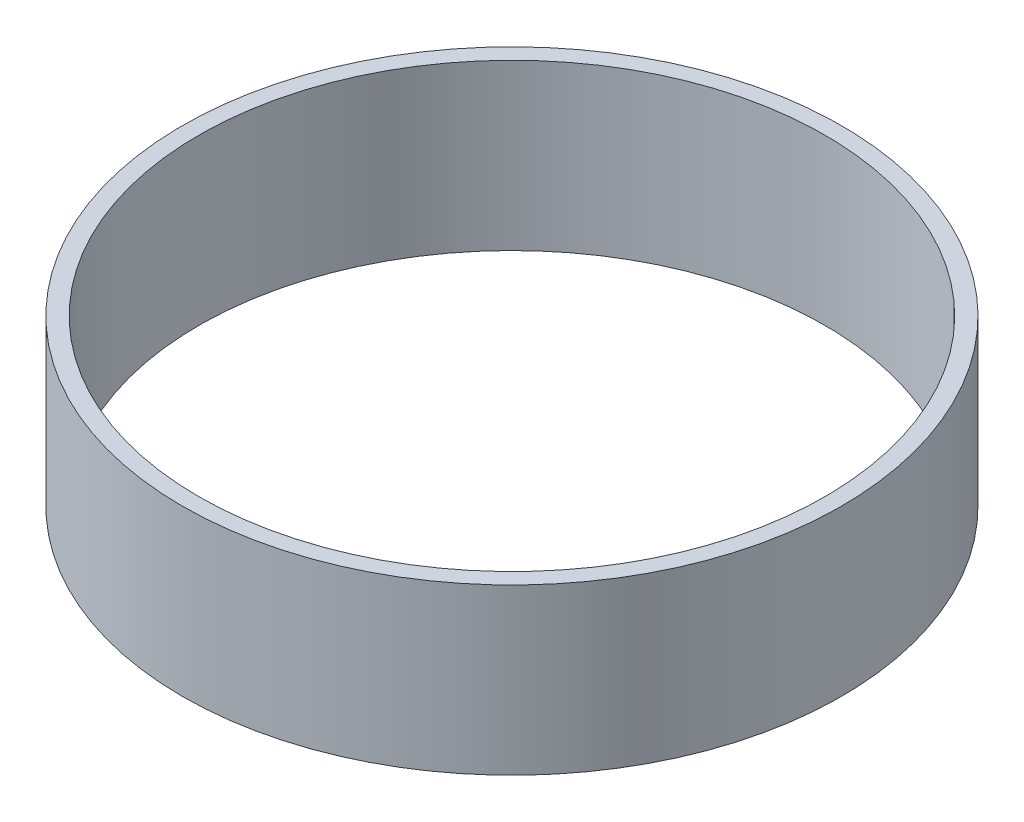
ISO-10303-21;
HEADER;
FILE_DESCRIPTION(('STEP AP214'),'2;1');
FILE_NAME('part.step','',(''),(''),'','','');
FILE_SCHEMA(('AUTOMOTIVE_DESIGN { 1 0 10303 214 1 1 1 1 }'));
ENDSEC;
DATA;
#1=APPLICATION_CONTEXT('core data for automotive mechanical design processes');
#2=APPLICATION_PROTOCOL_DEFINITION('international standard','automotive_design',2000,#1);
#3=PRODUCT_CONTEXT('',#1,'mechanical');
#4=PRODUCT('Part','Part','',(#3));
#5=PRODUCT_RELATED_PRODUCT_CATEGORY('part','',(#4));
#6=PRODUCT_DEFINITION_FORMATION('','',#4);
#7=PRODUCT_DEFINITION_CONTEXT('part definition',#1,'design');
#8=PRODUCT_DEFINITION('design','',#6,#7);
#9=PRODUCT_DEFINITION_SHAPE('','',#8);
#10=(LENGTH_UNIT() NAMED_UNIT(*) SI_UNIT(.MILLI.,.METRE.));
#11=(NAMED_UNIT(*) PLANE_ANGLE_UNIT() SI_UNIT($,.RADIAN.));
#12=(NAMED_UNIT(*) SI_UNIT($,.STERADIAN.) SOLID_ANGLE_UNIT());
#13=UNCERTAINTY_MEASURE_WITH_UNIT(LENGTH_MEASURE(1.E-05),#10,'distance_accuracy_value','');
#14=(GEOMETRIC_REPRESENTATION_CONTEXT(3) GLOBAL_UNCERTAINTY_ASSIGNED_CONTEXT((#13)) GLOBAL_UNIT_ASSIGNED_CONTEXT((#10,
#11,#12)) REPRESENTATION_CONTEXT('',''));
#15=CARTESIAN_POINT('',(0.,0.,0.));
#16=DIRECTION('',(0.,0.,1.));
#17=DIRECTION('',(1.,0.,0.));
#18=AXIS2_PLACEMENT_3D('',#15,#16,#17);
#19=CARTESIAN_POINT('',(0.,200.,0.));
#20=DIRECTION('',(0.,1.,0.));
#21=DIRECTION('',(0.,0.,1.));
#22=AXIS2_PLACEMENT_3D('',#19,#20,#21);
#23=PLANE('',#22);
#24=CARTESIAN_POINT('',(0.,200.,0.));
#25=DIRECTION('',(0.,1.,0.));
#26=DIRECTION('',(0.,0.,1.));
#27=AXIS2_PLACEMENT_3D('',#24,#25,#26);
#28=CIRCLE('',#27,400.);
#29=CARTESIAN_POINT('',(0.,200.,400.));
#30=VERTEX_POINT('',#29);
#31=EDGE_CURVE('E10',#30,#30,#28,.T.);
#32=ORIENTED_EDGE('',*,*,#31,.T.);
#33=EDGE_LOOP('',(#32));
#34=FACE_BOUND('',#33,.T.);
#35=CARTESIAN_POINT('',(0.,200.,0.));
#36=DIRECTION('',(0.,1.,0.));
#37=DIRECTION('',(0.,0.,1.));
#38=AXIS2_PLACEMENT_3D('',#35,#36,#37);
#39=CIRCLE('',#38,380.);
#40=CARTESIAN_POINT('',(0.,200.,380.));
#41=VERTEX_POINT('',#40);
#42=EDGE_CURVE('E56',#41,#41,#39,.T.);
#43=ORIENTED_EDGE('',*,*,#42,.F.);
#44=EDGE_LOOP('',(#43));
#45=FACE_BOUND('',#44,.T.);
#46=ADVANCED_FACE('F43',(#34,#45),#23,.T.);
#47=CARTESIAN_POINT('',(0.,0.,0.));
#48=DIRECTION('',(0.,1.,0.));
#49=DIRECTION('',(0.,0.,1.));
#50=AXIS2_PLACEMENT_3D('',#47,#48,#49);
#51=PLANE('',#50);
#52=CARTESIAN_POINT('',(0.,0.,0.));
#53=DIRECTION('',(0.,1.,0.));
#54=DIRECTION('',(0.,0.,1.));
#55=AXIS2_PLACEMENT_3D('',#52,#53,#54);
#56=CIRCLE('',#55,400.);
#57=CARTESIAN_POINT('',(0.,0.,400.));
#58=VERTEX_POINT('',#57);
#59=EDGE_CURVE('E47',#58,#58,#56,.T.);
#60=ORIENTED_EDGE('',*,*,#59,.F.);
#61=EDGE_LOOP('',(#60));
#62=FACE_BOUND('',#61,.T.);
#63=CARTESIAN_POINT('',(0.,0.,0.));
#64=DIRECTION('',(0.,1.,0.));
#65=DIRECTION('',(0.,0.,1.));
#66=AXIS2_PLACEMENT_3D('',#63,#64,#65);
#67=CIRCLE('',#66,380.);
#68=CARTESIAN_POINT('',(0.,0.,380.));
#69=VERTEX_POINT('',#68);
#70=EDGE_CURVE('E58',#69,#69,#67,.T.);
#71=ORIENTED_EDGE('',*,*,#70,.T.);
#72=EDGE_LOOP('',(#71));
#73=FACE_BOUND('',#72,.T.);
#74=ADVANCED_FACE('F70',(#62,#73),#51,.F.);
#75=CARTESIAN_POINT('',(0.,200.,0.));
#76=DIRECTION('',(0.,-1.,0.));
#77=DIRECTION('',(0.,0.,-1.));
#78=AXIS2_PLACEMENT_3D('',#75,#76,#77);
#79=CYLINDRICAL_SURFACE('',#78,400.);
#80=ORIENTED_EDGE('',*,*,#31,.F.);
#81=EDGE_LOOP('',(#80));
#82=FACE_BOUND('',#81,.T.);
#83=ORIENTED_EDGE('',*,*,#59,.T.);
#84=EDGE_LOOP('',(#83));
#85=FACE_BOUND('',#84,.T.);
#86=ADVANCED_FACE('F45',(#82,#85),#79,.T.);
#87=CARTESIAN_POINT('',(0.,200.,0.));
#88=DIRECTION('',(0.,-1.,0.));
#89=DIRECTION('',(0.,0.,-1.));
#90=AXIS2_PLACEMENT_3D('',#87,#88,#89);
#91=CYLINDRICAL_SURFACE('',#90,380.);
#92=ORIENTED_EDGE('',*,*,#42,.T.);
#93=EDGE_LOOP('',(#92));
#94=FACE_BOUND('',#93,.T.);
#95=ORIENTED_EDGE('',*,*,#70,.F.);
#96=EDGE_LOOP('',(#95));
#97=FACE_BOUND('',#96,.T.);
#98=ADVANCED_FACE('F66',(#94,#97),#91,.F.);
#99=CLOSED_SHELL('',(#46,#74,#86,#98));
#100=MANIFOLD_SOLID_BREP('B2',#99);
#101=ADVANCED_BREP_SHAPE_REPRESENTATION('',(#18,#100),#14);
#102=SHAPE_DEFINITION_REPRESENTATION(#9,#101);
ENDSEC;
END-ISO-10303-21;
